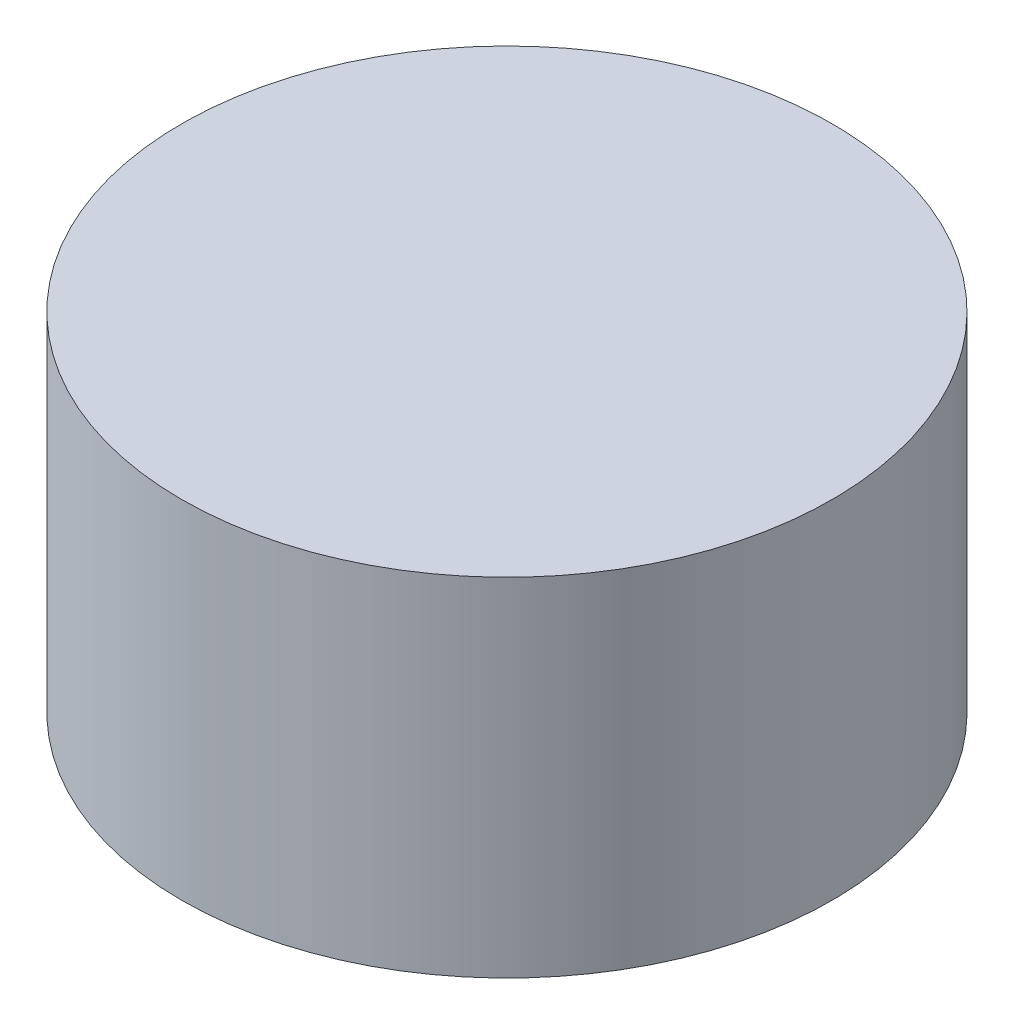
ISO-10303-21;
HEADER;
FILE_DESCRIPTION(('STEP AP214'),'2;1');
FILE_NAME('part.step','',(''),(''),'','','');
FILE_SCHEMA(('AUTOMOTIVE_DESIGN { 1 0 10303 214 1 1 1 1 }'));
ENDSEC;
DATA;
#1=APPLICATION_CONTEXT('core data for automotive mechanical design processes');
#2=APPLICATION_PROTOCOL_DEFINITION('international standard','automotive_design',2000,#1);
#3=PRODUCT_CONTEXT('',#1,'mechanical');
#4=PRODUCT('Part','Part','',(#3));
#5=PRODUCT_RELATED_PRODUCT_CATEGORY('part','',(#4));
#6=PRODUCT_DEFINITION_FORMATION('','',#4);
#7=PRODUCT_DEFINITION_CONTEXT('part definition',#1,'design');
#8=PRODUCT_DEFINITION('design','',#6,#7);
#9=PRODUCT_DEFINITION_SHAPE('','',#8);
#10=(LENGTH_UNIT() NAMED_UNIT(*) SI_UNIT(.MILLI.,.METRE.));
#11=(NAMED_UNIT(*) PLANE_ANGLE_UNIT() SI_UNIT($,.RADIAN.));
#12=(NAMED_UNIT(*) SI_UNIT($,.STERADIAN.) SOLID_ANGLE_UNIT());
#13=UNCERTAINTY_MEASURE_WITH_UNIT(LENGTH_MEASURE(1.E-05),#10,'distance_accuracy_value','');
#14=(GEOMETRIC_REPRESENTATION_CONTEXT(3) GLOBAL_UNCERTAINTY_ASSIGNED_CONTEXT((#13)) GLOBAL_UNIT_ASSIGNED_CONTEXT((#10,
#11,#12)) REPRESENTATION_CONTEXT('',''));
#15=CARTESIAN_POINT('',(0.,0.,0.));
#16=DIRECTION('',(0.,0.,1.));
#17=DIRECTION('',(1.,0.,0.));
#18=AXIS2_PLACEMENT_3D('',#15,#16,#17);
#19=CARTESIAN_POINT('',(0.,65.532,0.));
#20=DIRECTION('',(0.,-1.,0.));
#21=DIRECTION('',(0.,0.,-1.));
#22=AXIS2_PLACEMENT_3D('',#19,#20,#21);
#23=CYLINDRICAL_SURFACE('',#22,61.4206688377514);
#24=CARTESIAN_POINT('',(0.,65.532,0.));
#25=DIRECTION('',(0.,1.,0.));
#26=DIRECTION('',(0.,0.,1.));
#27=AXIS2_PLACEMENT_3D('',#24,#25,#26);
#28=CIRCLE('',#27,61.4206688377514);
#29=CARTESIAN_POINT('',(0.,65.532,61.4206688377514));
#30=VERTEX_POINT('',#29);
#31=EDGE_CURVE('E10',#30,#30,#28,.T.);
#32=ORIENTED_EDGE('',*,*,#31,.F.);
#33=EDGE_LOOP('',(#32));
#34=FACE_BOUND('',#33,.T.);
#35=CARTESIAN_POINT('',(0.,0.,0.));
#36=DIRECTION('',(0.,1.,0.));
#37=DIRECTION('',(0.,0.,1.));
#38=AXIS2_PLACEMENT_3D('',#35,#36,#37);
#39=CIRCLE('',#38,61.4206688377514);
#40=CARTESIAN_POINT('',(0.,0.,61.4206688377514));
#41=VERTEX_POINT('',#40);
#42=EDGE_CURVE('E38',#41,#41,#39,.T.);
#43=ORIENTED_EDGE('',*,*,#42,.T.);
#44=EDGE_LOOP('',(#43));
#45=FACE_BOUND('',#44,.T.);
#46=ADVANCED_FACE('F35',(#34,#45),#23,.T.);
#47=CARTESIAN_POINT('',(0.,65.532,0.));
#48=DIRECTION('',(0.,1.,0.));
#49=DIRECTION('',(0.,0.,1.));
#50=AXIS2_PLACEMENT_3D('',#47,#48,#49);
#51=PLANE('',#50);
#52=ORIENTED_EDGE('',*,*,#31,.T.);
#53=EDGE_LOOP('',(#52));
#54=FACE_BOUND('',#53,.T.);
#55=ADVANCED_FACE('F50',(#54),#51,.T.);
#56=CARTESIAN_POINT('',(0.,0.,0.));
#57=DIRECTION('',(0.,1.,0.));
#58=DIRECTION('',(0.,0.,1.));
#59=AXIS2_PLACEMENT_3D('',#56,#57,#58);
#60=PLANE('',#59);
#61=ORIENTED_EDGE('',*,*,#42,.F.);
#62=EDGE_LOOP('',(#61));
#63=FACE_BOUND('',#62,.T.);
#64=ADVANCED_FACE('F48',(#63),#60,.F.);
#65=CLOSED_SHELL('',(#46,#55,#64));
#66=MANIFOLD_SOLID_BREP('B2',#65);
#67=ADVANCED_BREP_SHAPE_REPRESENTATION('',(#18,#66),#14);
#68=SHAPE_DEFINITION_REPRESENTATION(#9,#67);
ENDSEC;
END-ISO-10303-21;
